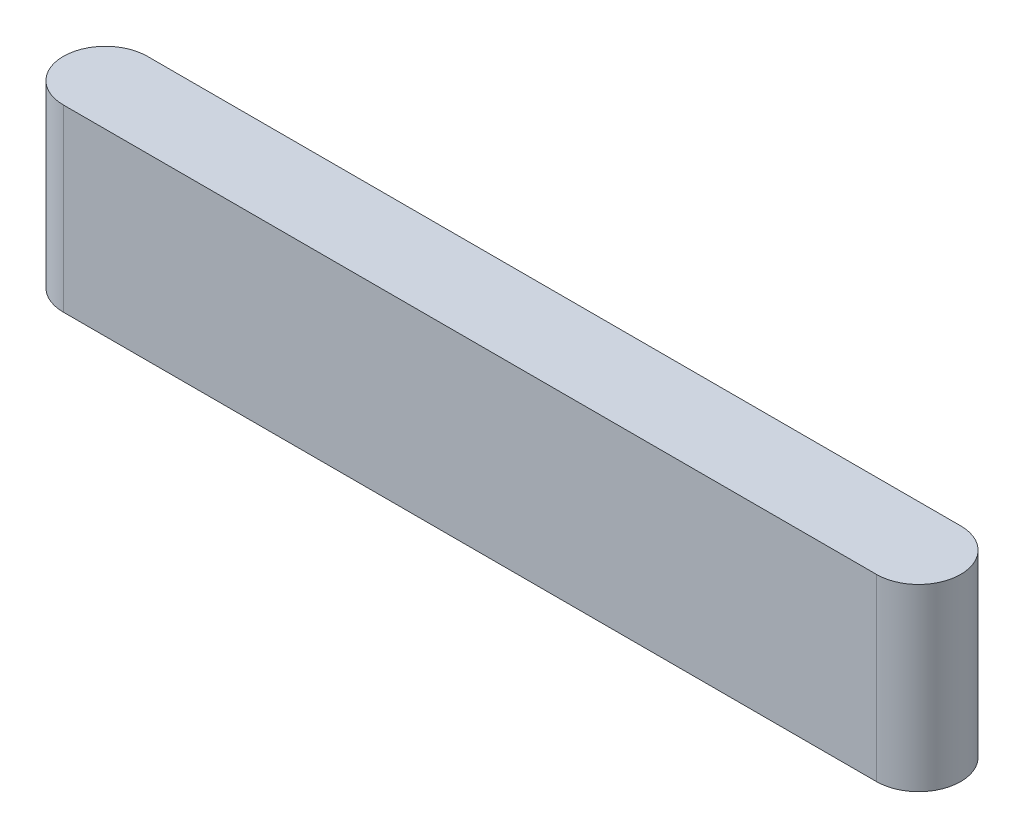
ISO-10303-21;
HEADER;
FILE_DESCRIPTION(('STEP AP214'),'2;1');
FILE_NAME('part.step','',(''),(''),'','','');
FILE_SCHEMA(('AUTOMOTIVE_DESIGN { 1 0 10303 214 1 1 1 1 }'));
ENDSEC;
DATA;
#1=APPLICATION_CONTEXT('core data for automotive mechanical design processes');
#2=APPLICATION_PROTOCOL_DEFINITION('international standard','automotive_design',2000,#1);
#3=PRODUCT_CONTEXT('',#1,'mechanical');
#4=PRODUCT('Part','Part','',(#3));
#5=PRODUCT_RELATED_PRODUCT_CATEGORY('part','',(#4));
#6=PRODUCT_DEFINITION_FORMATION('','',#4);
#7=PRODUCT_DEFINITION_CONTEXT('part definition',#1,'design');
#8=PRODUCT_DEFINITION('design','',#6,#7);
#9=PRODUCT_DEFINITION_SHAPE('','',#8);
#10=(LENGTH_UNIT() NAMED_UNIT(*) SI_UNIT(.MILLI.,.METRE.));
#11=(NAMED_UNIT(*) PLANE_ANGLE_UNIT() SI_UNIT($,.RADIAN.));
#12=(NAMED_UNIT(*) SI_UNIT($,.STERADIAN.) SOLID_ANGLE_UNIT());
#13=UNCERTAINTY_MEASURE_WITH_UNIT(LENGTH_MEASURE(1.E-05),#10,'distance_accuracy_value','');
#14=(GEOMETRIC_REPRESENTATION_CONTEXT(3) GLOBAL_UNCERTAINTY_ASSIGNED_CONTEXT((#13)) GLOBAL_UNIT_ASSIGNED_CONTEXT((#10,
#11,#12)) REPRESENTATION_CONTEXT('',''));
#15=CARTESIAN_POINT('',(0.,0.,0.));
#16=DIRECTION('',(0.,0.,1.));
#17=DIRECTION('',(1.,0.,0.));
#18=AXIS2_PLACEMENT_3D('',#15,#16,#17);
#19=CARTESIAN_POINT('',(0.,3.2,0.));
#20=DIRECTION('',(0.,-1.,0.));
#21=DIRECTION('',(0.,0.,-1.));
#22=AXIS2_PLACEMENT_3D('',#19,#20,#21);
#23=CYLINDRICAL_SURFACE('',#22,0.750000000000001);
#24=CARTESIAN_POINT('',(0.,0.,0.));
#25=DIRECTION('',(0.,1.,0.));
#26=DIRECTION('',(0.,0.,1.));
#27=AXIS2_PLACEMENT_3D('',#24,#25,#26);
#28=CIRCLE('',#27,0.750000000000001);
#29=CARTESIAN_POINT('',(0.,0.,-0.750000000000001));
#30=VERTEX_POINT('',#29);
#31=CARTESIAN_POINT('',(0.,0.,0.750000000000001));
#32=VERTEX_POINT('',#31);
#33=EDGE_CURVE('E107',#30,#32,#28,.T.);
#34=ORIENTED_EDGE('',*,*,#33,.T.);
#35=DIRECTION('',(0.,-1.,0.));
#36=VECTOR('',#35,1.);
#37=CARTESIAN_POINT('',(0.,3.2,0.750000000000001));
#38=LINE('',#37,#36);
#39=CARTESIAN_POINT('',(0.,3.2,0.750000000000001));
#40=VERTEX_POINT('',#39);
#41=EDGE_CURVE('E11',#40,#32,#38,.T.);
#42=ORIENTED_EDGE('',*,*,#41,.F.);
#43=CARTESIAN_POINT('',(0.,3.2,0.));
#44=DIRECTION('',(0.,1.,0.));
#45=DIRECTION('',(0.,0.,1.));
#46=AXIS2_PLACEMENT_3D('',#43,#44,#45);
#47=CIRCLE('',#46,0.750000000000001);
#48=CARTESIAN_POINT('',(0.,3.2,-0.750000000000001));
#49=VERTEX_POINT('',#48);
#50=EDGE_CURVE('E91',#49,#40,#47,.T.);
#51=ORIENTED_EDGE('',*,*,#50,.F.);
#52=DIRECTION('',(0.,-1.,0.));
#53=VECTOR('',#52,1.);
#54=CARTESIAN_POINT('',(0.,3.2,-0.750000000000001));
#55=LINE('',#54,#53);
#56=EDGE_CURVE('E103',#49,#30,#55,.T.);
#57=ORIENTED_EDGE('',*,*,#56,.T.);
#58=EDGE_LOOP('',(#34,#42,#51,#57));
#59=FACE_BOUND('',#58,.T.);
#60=ADVANCED_FACE('F39',(#59),#23,.T.);
#61=CARTESIAN_POINT('',(0.,3.2,0.750000000000001));
#62=DIRECTION('',(0.,0.,-1.));
#63=DIRECTION('',(-1.,0.,0.));
#64=AXIS2_PLACEMENT_3D('',#61,#62,#63);
#65=PLANE('',#64);
#66=DIRECTION('',(1.,0.,0.));
#67=VECTOR('',#66,1.);
#68=CARTESIAN_POINT('',(0.,0.,0.750000000000001));
#69=LINE('',#68,#67);
#70=CARTESIAN_POINT('',(14.5,0.,0.75));
#71=VERTEX_POINT('',#70);
#72=EDGE_CURVE('E96',#32,#71,#69,.T.);
#73=ORIENTED_EDGE('',*,*,#72,.T.);
#74=DIRECTION('',(0.,-1.,0.));
#75=VECTOR('',#74,1.);
#76=CARTESIAN_POINT('',(14.5,3.2,0.75));
#77=LINE('',#76,#75);
#78=CARTESIAN_POINT('',(14.5,3.2,0.75));
#79=VERTEX_POINT('',#78);
#80=EDGE_CURVE('E48',#79,#71,#77,.T.);
#81=ORIENTED_EDGE('',*,*,#80,.F.);
#82=DIRECTION('',(1.,0.,0.));
#83=VECTOR('',#82,1.);
#84=CARTESIAN_POINT('',(0.,3.2,0.750000000000001));
#85=LINE('',#84,#83);
#86=EDGE_CURVE('E86',#40,#79,#85,.T.);
#87=ORIENTED_EDGE('',*,*,#86,.F.);
#88=ORIENTED_EDGE('',*,*,#41,.T.);
#89=EDGE_LOOP('',(#73,#81,#87,#88));
#90=FACE_BOUND('',#89,.T.);
#91=ADVANCED_FACE('F95',(#90),#65,.F.);
#92=CARTESIAN_POINT('',(14.5,3.2,0.));
#93=DIRECTION('',(0.,-1.,0.));
#94=DIRECTION('',(0.,0.,-1.));
#95=AXIS2_PLACEMENT_3D('',#92,#93,#94);
#96=CYLINDRICAL_SURFACE('',#95,0.75);
#97=CARTESIAN_POINT('',(14.5,0.,0.));
#98=DIRECTION('',(0.,1.,0.));
#99=DIRECTION('',(0.,0.,1.));
#100=AXIS2_PLACEMENT_3D('',#97,#98,#99);
#101=CIRCLE('',#100,0.75);
#102=CARTESIAN_POINT('',(14.5,0.,-0.75));
#103=VERTEX_POINT('',#102);
#104=EDGE_CURVE('E73',#71,#103,#101,.T.);
#105=ORIENTED_EDGE('',*,*,#104,.T.);
#106=DIRECTION('',(0.,-1.,0.));
#107=VECTOR('',#106,1.);
#108=CARTESIAN_POINT('',(14.5,3.2,-0.75));
#109=LINE('',#108,#107);
#110=CARTESIAN_POINT('',(14.5,3.2,-0.75));
#111=VERTEX_POINT('',#110);
#112=EDGE_CURVE('E98',#111,#103,#109,.T.);
#113=ORIENTED_EDGE('',*,*,#112,.F.);
#114=CARTESIAN_POINT('',(14.5,3.2,0.));
#115=DIRECTION('',(0.,1.,0.));
#116=DIRECTION('',(0.,0.,1.));
#117=AXIS2_PLACEMENT_3D('',#114,#115,#116);
#118=CIRCLE('',#117,0.75);
#119=EDGE_CURVE('E89',#79,#111,#118,.T.);
#120=ORIENTED_EDGE('',*,*,#119,.F.);
#121=ORIENTED_EDGE('',*,*,#80,.T.);
#122=EDGE_LOOP('',(#105,#113,#120,#121));
#123=FACE_BOUND('',#122,.T.);
#124=ADVANCED_FACE('F99',(#123),#96,.T.);
#125=CARTESIAN_POINT('',(0.,3.2,-0.750000000000001));
#126=DIRECTION('',(0.,0.,1.));
#127=DIRECTION('',(1.,0.,0.));
#128=AXIS2_PLACEMENT_3D('',#125,#126,#127);
#129=PLANE('',#128);
#130=DIRECTION('',(-1.,0.,0.));
#131=VECTOR('',#130,1.);
#132=CARTESIAN_POINT('',(0.,0.,-0.750000000000001));
#133=LINE('',#132,#131);
#134=EDGE_CURVE('E79',#103,#30,#133,.T.);
#135=ORIENTED_EDGE('',*,*,#134,.T.);
#136=ORIENTED_EDGE('',*,*,#56,.F.);
#137=DIRECTION('',(-1.,0.,0.));
#138=VECTOR('',#137,1.);
#139=CARTESIAN_POINT('',(0.,3.2,-0.750000000000001));
#140=LINE('',#139,#138);
#141=EDGE_CURVE('E56',#111,#49,#140,.T.);
#142=ORIENTED_EDGE('',*,*,#141,.F.);
#143=ORIENTED_EDGE('',*,*,#112,.T.);
#144=EDGE_LOOP('',(#135,#136,#142,#143));
#145=FACE_BOUND('',#144,.T.);
#146=ADVANCED_FACE('F120',(#145),#129,.F.);
#147=CARTESIAN_POINT('',(0.,3.2,0.));
#148=DIRECTION('',(0.,1.,0.));
#149=DIRECTION('',(0.,0.,1.));
#150=AXIS2_PLACEMENT_3D('',#147,#148,#149);
#151=PLANE('',#150);
#152=ORIENTED_EDGE('',*,*,#50,.T.);
#153=ORIENTED_EDGE('',*,*,#86,.T.);
#154=ORIENTED_EDGE('',*,*,#119,.T.);
#155=ORIENTED_EDGE('',*,*,#141,.T.);
#156=EDGE_LOOP('',(#152,#153,#154,#155));
#157=FACE_BOUND('',#156,.T.);
#158=ADVANCED_FACE('F87',(#157),#151,.T.);
#159=CARTESIAN_POINT('',(0.,0.,0.));
#160=DIRECTION('',(0.,1.,0.));
#161=DIRECTION('',(0.,0.,1.));
#162=AXIS2_PLACEMENT_3D('',#159,#160,#161);
#163=PLANE('',#162);
#164=ORIENTED_EDGE('',*,*,#33,.F.);
#165=ORIENTED_EDGE('',*,*,#134,.F.);
#166=ORIENTED_EDGE('',*,*,#104,.F.);
#167=ORIENTED_EDGE('',*,*,#72,.F.);
#168=EDGE_LOOP('',(#164,#165,#166,#167));
#169=FACE_BOUND('',#168,.T.);
#170=ADVANCED_FACE('F123',(#169),#163,.F.);
#171=CLOSED_SHELL('',(#60,#91,#124,#146,#158,#170));
#172=MANIFOLD_SOLID_BREP('B2',#171);
#173=ADVANCED_BREP_SHAPE_REPRESENTATION('',(#18,#172),#14);
#174=SHAPE_DEFINITION_REPRESENTATION(#9,#173);
ENDSEC;
END-ISO-10303-21;
